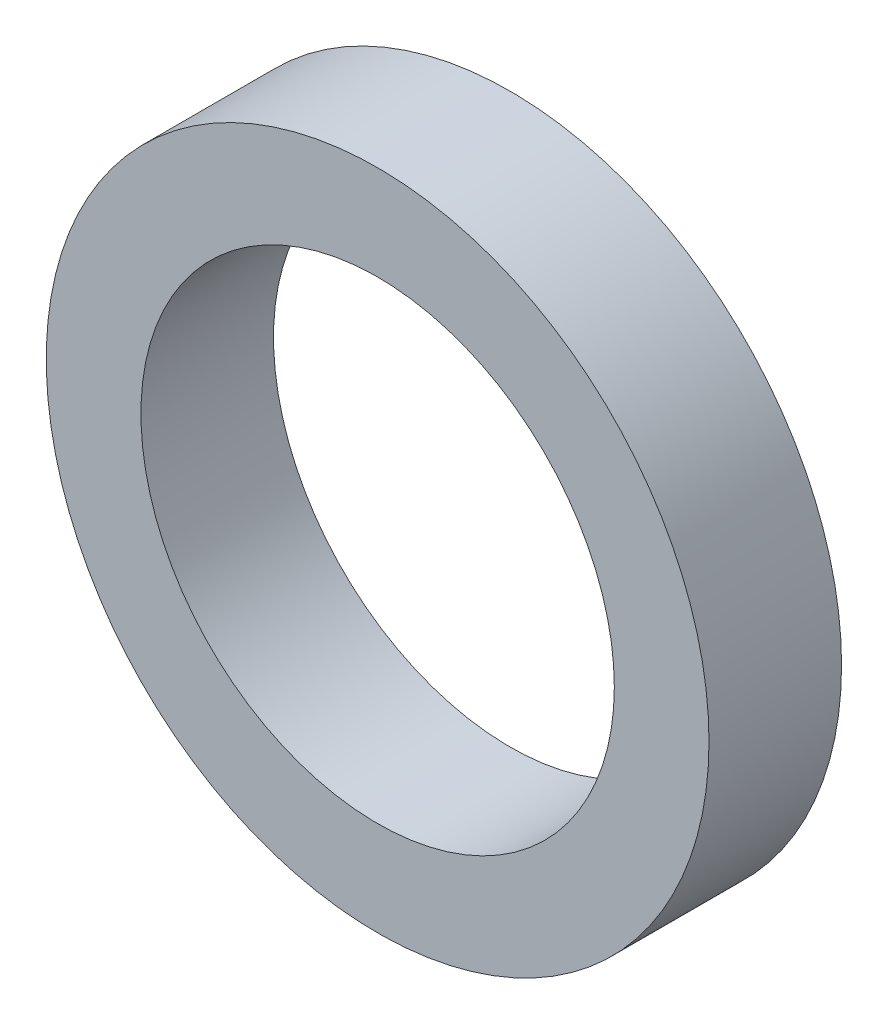
ISO-10303-21;
HEADER;
FILE_DESCRIPTION(('STEP AP214'),'2;1');
FILE_NAME('part.step','',(''),(''),'','','');
FILE_SCHEMA(('AUTOMOTIVE_DESIGN { 1 0 10303 214 1 1 1 1 }'));
ENDSEC;
DATA;
#1=APPLICATION_CONTEXT('core data for automotive mechanical design processes');
#2=APPLICATION_PROTOCOL_DEFINITION('international standard','automotive_design',2000,#1);
#3=PRODUCT_CONTEXT('',#1,'mechanical');
#4=PRODUCT('Part','Part','',(#3));
#5=PRODUCT_RELATED_PRODUCT_CATEGORY('part','',(#4));
#6=PRODUCT_DEFINITION_FORMATION('','',#4);
#7=PRODUCT_DEFINITION_CONTEXT('part definition',#1,'design');
#8=PRODUCT_DEFINITION('design','',#6,#7);
#9=PRODUCT_DEFINITION_SHAPE('','',#8);
#10=(LENGTH_UNIT() NAMED_UNIT(*) SI_UNIT(.MILLI.,.METRE.));
#11=(NAMED_UNIT(*) PLANE_ANGLE_UNIT() SI_UNIT($,.RADIAN.));
#12=(NAMED_UNIT(*) SI_UNIT($,.STERADIAN.) SOLID_ANGLE_UNIT());
#13=UNCERTAINTY_MEASURE_WITH_UNIT(LENGTH_MEASURE(1.E-05),#10,'distance_accuracy_value','');
#14=(GEOMETRIC_REPRESENTATION_CONTEXT(3) GLOBAL_UNCERTAINTY_ASSIGNED_CONTEXT((#13)) GLOBAL_UNIT_ASSIGNED_CONTEXT((#10,
#11,#12)) REPRESENTATION_CONTEXT('',''));
#15=CARTESIAN_POINT('',(0.,0.,0.));
#16=DIRECTION('',(0.,0.,1.));
#17=DIRECTION('',(1.,0.,0.));
#18=AXIS2_PLACEMENT_3D('',#15,#16,#17);
#19=CARTESIAN_POINT('',(0.,0.,14.));
#20=DIRECTION('',(0.,0.,1.));
#21=DIRECTION('',(1.,0.,0.));
#22=AXIS2_PLACEMENT_3D('',#19,#20,#21);
#23=PLANE('',#22);
#24=CARTESIAN_POINT('',(0.,0.,14.));
#25=DIRECTION('',(0.,0.,1.));
#26=DIRECTION('',(1.,0.,0.));
#27=AXIS2_PLACEMENT_3D('',#24,#25,#26);
#28=CIRCLE('',#27,35.);
#29=CARTESIAN_POINT('',(35.,0.,14.));
#30=VERTEX_POINT('',#29);
#31=EDGE_CURVE('E10',#30,#30,#28,.T.);
#32=ORIENTED_EDGE('',*,*,#31,.T.);
#33=EDGE_LOOP('',(#32));
#34=FACE_BOUND('',#33,.T.);
#35=CARTESIAN_POINT('',(0.,0.,14.));
#36=DIRECTION('',(0.,0.,1.));
#37=DIRECTION('',(1.,0.,0.));
#38=AXIS2_PLACEMENT_3D('',#35,#36,#37);
#39=CIRCLE('',#38,25.);
#40=CARTESIAN_POINT('',(25.,0.,14.));
#41=VERTEX_POINT('',#40);
#42=EDGE_CURVE('E48',#41,#41,#39,.T.);
#43=ORIENTED_EDGE('',*,*,#42,.F.);
#44=EDGE_LOOP('',(#43));
#45=FACE_BOUND('',#44,.T.);
#46=ADVANCED_FACE('F37',(#34,#45),#23,.T.);
#47=CARTESIAN_POINT('',(0.,0.,0.));
#48=DIRECTION('',(0.,0.,1.));
#49=DIRECTION('',(1.,0.,0.));
#50=AXIS2_PLACEMENT_3D('',#47,#48,#49);
#51=PLANE('',#50);
#52=CARTESIAN_POINT('',(0.,0.,0.));
#53=DIRECTION('',(0.,0.,1.));
#54=DIRECTION('',(1.,0.,0.));
#55=AXIS2_PLACEMENT_3D('',#52,#53,#54);
#56=CIRCLE('',#55,35.);
#57=CARTESIAN_POINT('',(35.,0.,0.));
#58=VERTEX_POINT('',#57);
#59=EDGE_CURVE('E41',#58,#58,#56,.T.);
#60=ORIENTED_EDGE('',*,*,#59,.F.);
#61=EDGE_LOOP('',(#60));
#62=FACE_BOUND('',#61,.T.);
#63=CARTESIAN_POINT('',(0.,0.,0.));
#64=DIRECTION('',(0.,0.,1.));
#65=DIRECTION('',(1.,0.,0.));
#66=AXIS2_PLACEMENT_3D('',#63,#64,#65);
#67=CIRCLE('',#66,25.);
#68=CARTESIAN_POINT('',(25.,0.,0.));
#69=VERTEX_POINT('',#68);
#70=EDGE_CURVE('E50',#69,#69,#67,.T.);
#71=ORIENTED_EDGE('',*,*,#70,.T.);
#72=EDGE_LOOP('',(#71));
#73=FACE_BOUND('',#72,.T.);
#74=ADVANCED_FACE('F60',(#62,#73),#51,.F.);
#75=CARTESIAN_POINT('',(0.,0.,14.));
#76=DIRECTION('',(0.,0.,-1.));
#77=DIRECTION('',(-1.,0.,0.));
#78=AXIS2_PLACEMENT_3D('',#75,#76,#77);
#79=CYLINDRICAL_SURFACE('',#78,35.);
#80=ORIENTED_EDGE('',*,*,#31,.F.);
#81=EDGE_LOOP('',(#80));
#82=FACE_BOUND('',#81,.T.);
#83=ORIENTED_EDGE('',*,*,#59,.T.);
#84=EDGE_LOOP('',(#83));
#85=FACE_BOUND('',#84,.T.);
#86=ADVANCED_FACE('F39',(#82,#85),#79,.T.);
#87=CARTESIAN_POINT('',(0.,0.,14.));
#88=DIRECTION('',(0.,0.,-1.));
#89=DIRECTION('',(-1.,0.,0.));
#90=AXIS2_PLACEMENT_3D('',#87,#88,#89);
#91=CYLINDRICAL_SURFACE('',#90,25.);
#92=ORIENTED_EDGE('',*,*,#42,.T.);
#93=EDGE_LOOP('',(#92));
#94=FACE_BOUND('',#93,.T.);
#95=ORIENTED_EDGE('',*,*,#70,.F.);
#96=EDGE_LOOP('',(#95));
#97=FACE_BOUND('',#96,.T.);
#98=ADVANCED_FACE('F56',(#94,#97),#91,.F.);
#99=CLOSED_SHELL('',(#46,#74,#86,#98));
#100=MANIFOLD_SOLID_BREP('B2',#99);
#101=ADVANCED_BREP_SHAPE_REPRESENTATION('',(#18,#100),#14);
#102=SHAPE_DEFINITION_REPRESENTATION(#9,#101);
ENDSEC;
END-ISO-10303-21;
